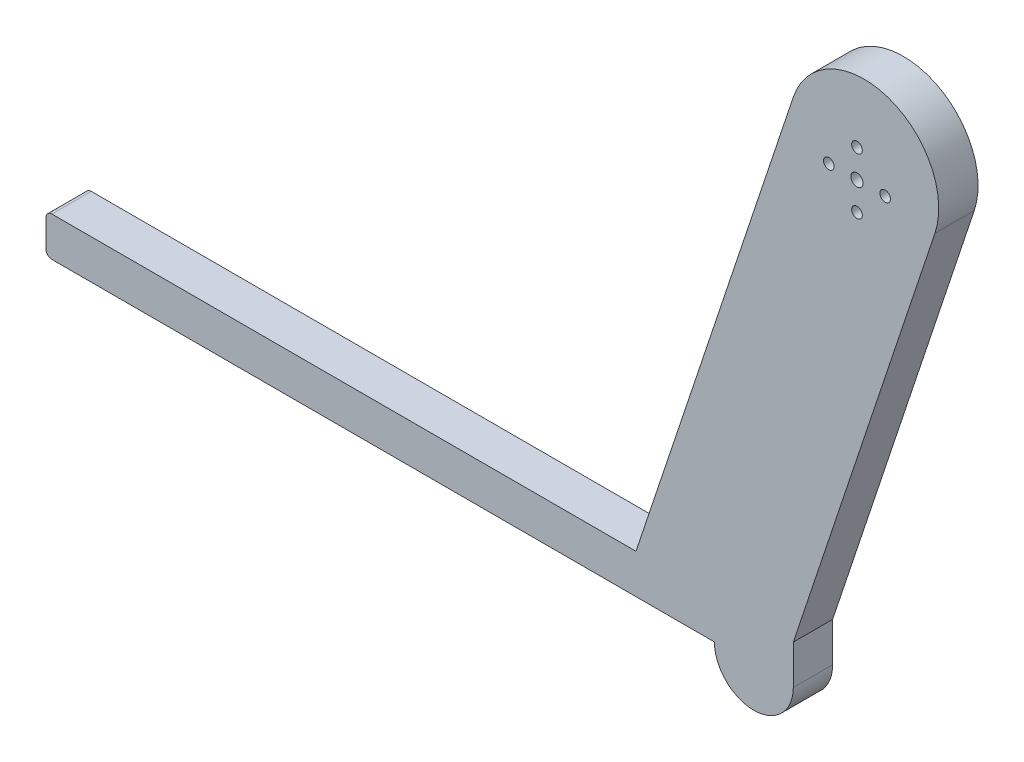
ISO-10303-21;
HEADER;
FILE_DESCRIPTION(('STEP AP214'),'2;1');
FILE_NAME('part.step','',(''),(''),'','','');
FILE_SCHEMA(('AUTOMOTIVE_DESIGN { 1 0 10303 214 1 1 1 1 }'));
ENDSEC;
DATA;
#1=APPLICATION_CONTEXT('core data for automotive mechanical design processes');
#2=APPLICATION_PROTOCOL_DEFINITION('international standard','automotive_design',2000,#1);
#3=PRODUCT_CONTEXT('',#1,'mechanical');
#4=PRODUCT('Part','Part','',(#3));
#5=PRODUCT_RELATED_PRODUCT_CATEGORY('part','',(#4));
#6=PRODUCT_DEFINITION_FORMATION('','',#4);
#7=PRODUCT_DEFINITION_CONTEXT('part definition',#1,'design');
#8=PRODUCT_DEFINITION('design','',#6,#7);
#9=PRODUCT_DEFINITION_SHAPE('','',#8);
#10=(LENGTH_UNIT() NAMED_UNIT(*) SI_UNIT(.MILLI.,.METRE.));
#11=(NAMED_UNIT(*) PLANE_ANGLE_UNIT() SI_UNIT($,.RADIAN.));
#12=(NAMED_UNIT(*) SI_UNIT($,.STERADIAN.) SOLID_ANGLE_UNIT());
#13=UNCERTAINTY_MEASURE_WITH_UNIT(LENGTH_MEASURE(1.E-05),#10,'distance_accuracy_value','');
#14=(GEOMETRIC_REPRESENTATION_CONTEXT(3) GLOBAL_UNCERTAINTY_ASSIGNED_CONTEXT((#13)) GLOBAL_UNIT_ASSIGNED_CONTEXT((#10,
#11,#12)) REPRESENTATION_CONTEXT('',''));
#15=CARTESIAN_POINT('',(0.,0.,0.));
#16=DIRECTION('',(0.,0.,1.));
#17=DIRECTION('',(1.,0.,0.));
#18=AXIS2_PLACEMENT_3D('',#15,#16,#17);
#19=CARTESIAN_POINT('',(29.9685982144808,-10.,10.));
#20=DIRECTION('',(0.,0.,1.));
#21=DIRECTION('',(1.,0.,0.));
#22=AXIS2_PLACEMENT_3D('',#19,#20,#21);
#23=PLANE('',#22);
#24=CARTESIAN_POINT('',(56.1908642313417,109.872544890887,9.99999999999992));
#25=DIRECTION('',(0.,0.,1.));
#26=DIRECTION('',(1.,0.,0.));
#27=AXIS2_PLACEMENT_3D('',#24,#25,#26);
#28=CIRCLE('',#27,1.54999999999999);
#29=CARTESIAN_POINT('',(57.7408642313417,109.872544890887,9.99999999999992));
#30=VERTEX_POINT('',#29);
#31=EDGE_CURVE('E228',#30,#30,#28,.T.);
#32=ORIENTED_EDGE('',*,*,#31,.F.);
#33=EDGE_LOOP('',(#32));
#34=FACE_BOUND('',#33,.T.);
#35=CARTESIAN_POINT('',(63.3498642313417,109.872544890887,10.));
#36=DIRECTION('',(0.,0.,1.));
#37=DIRECTION('',(1.,0.,0.));
#38=AXIS2_PLACEMENT_3D('',#35,#36,#37);
#39=CIRCLE('',#38,1.35000000000002);
#40=CARTESIAN_POINT('',(64.6998642313417,109.872544890887,10.));
#41=VERTEX_POINT('',#40);
#42=EDGE_CURVE('E179',#41,#41,#39,.T.);
#43=ORIENTED_EDGE('',*,*,#42,.F.);
#44=EDGE_LOOP('',(#43));
#45=FACE_BOUND('',#44,.T.);
#46=CARTESIAN_POINT('',(56.1908642313417,117.031544890887,10.));
#47=DIRECTION('',(0.,0.,1.));
#48=DIRECTION('',(1.,0.,0.));
#49=AXIS2_PLACEMENT_3D('',#46,#47,#48);
#50=CIRCLE('',#49,1.35000000000001);
#51=CARTESIAN_POINT('',(57.5408642313417,117.031544890887,10.));
#52=VERTEX_POINT('',#51);
#53=EDGE_CURVE('E224',#52,#52,#50,.T.);
#54=ORIENTED_EDGE('',*,*,#53,.F.);
#55=EDGE_LOOP('',(#54));
#56=FACE_BOUND('',#55,.T.);
#57=DIRECTION('',(1.,0.,0.));
#58=VECTOR('',#57,1.);
#59=CARTESIAN_POINT('',(-148.5,0.,10.));
#60=LINE('',#59,#58);
#61=CARTESIAN_POINT('',(-148.5,0.,10.));
#62=VERTEX_POINT('',#61);
#63=CARTESIAN_POINT('',(0.,0.,10.));
#64=VERTEX_POINT('',#63);
#65=EDGE_CURVE('E150',#62,#64,#60,.T.);
#66=ORIENTED_EDGE('',*,*,#65,.F.);
#67=CARTESIAN_POINT('',(-148.5,-1.50000000000002,10.));
#68=DIRECTION('',(0.,0.,1.));
#69=DIRECTION('',(1.,0.,0.));
#70=AXIS2_PLACEMENT_3D('',#67,#68,#69);
#71=CIRCLE('',#70,1.5);
#72=CARTESIAN_POINT('',(-150.,-1.50000000000002,10.));
#73=VERTEX_POINT('',#72);
#74=EDGE_CURVE('E112',#62,#73,#71,.T.);
#75=ORIENTED_EDGE('',*,*,#74,.T.);
#76=DIRECTION('',(0.,-1.,0.));
#77=VECTOR('',#76,1.);
#78=CARTESIAN_POINT('',(-150.,-1.50000000000002,10.));
#79=LINE('',#78,#77);
#80=CARTESIAN_POINT('',(-150.,-8.50000000000002,10.));
#81=VERTEX_POINT('',#80);
#82=EDGE_CURVE('E105',#73,#81,#79,.T.);
#83=ORIENTED_EDGE('',*,*,#82,.T.);
#84=CARTESIAN_POINT('',(-148.5,-8.50000000000002,10.));
#85=DIRECTION('',(0.,0.,1.));
#86=DIRECTION('',(1.,0.,0.));
#87=AXIS2_PLACEMENT_3D('',#84,#85,#86);
#88=CIRCLE('',#87,1.49999999999999);
#89=CARTESIAN_POINT('',(-148.5,-10.,10.));
#90=VERTEX_POINT('',#89);
#91=EDGE_CURVE('E110',#81,#90,#88,.T.);
#92=ORIENTED_EDGE('',*,*,#91,.T.);
#93=DIRECTION('',(1.,0.,0.));
#94=VECTOR('',#93,1.);
#95=CARTESIAN_POINT('',(-148.5,-10.,10.));
#96=LINE('',#95,#94);
#97=CARTESIAN_POINT('',(19.9371964289617,-10.,10.));
#98=VERTEX_POINT('',#97);
#99=EDGE_CURVE('E127',#90,#98,#96,.T.);
#100=ORIENTED_EDGE('',*,*,#99,.T.);
#101=CARTESIAN_POINT('',(29.9685982144808,-10.,10.));
#102=DIRECTION('',(0.,0.,1.));
#103=DIRECTION('',(1.,0.,0.));
#104=AXIS2_PLACEMENT_3D('',#101,#102,#103);
#105=CIRCLE('',#104,10.0314017855192);
#106=CARTESIAN_POINT('',(40.,-10.,10.));
#107=VERTEX_POINT('',#106);
#108=EDGE_CURVE('E129',#98,#107,#105,.T.);
#109=ORIENTED_EDGE('',*,*,#108,.T.);
#110=DIRECTION('',(0.,1.,0.));
#111=VECTOR('',#110,1.);
#112=CARTESIAN_POINT('',(40.,-8.50000000000001,10.));
#113=LINE('',#112,#111);
#114=CARTESIAN_POINT('',(40.,0.,10.));
#115=VERTEX_POINT('',#114);
#116=EDGE_CURVE('E92',#107,#115,#113,.T.);
#117=ORIENTED_EDGE('',*,*,#116,.T.);
#118=DIRECTION('',(0.316227766016838,0.948683298050514,0.));
#119=VECTOR('',#118,1.);
#120=CARTESIAN_POINT('',(40.,0.,10.));
#121=LINE('',#120,#119);
#122=CARTESIAN_POINT('',(76.,108.,10.));
#123=VERTEX_POINT('',#122);
#124=EDGE_CURVE('E169',#115,#123,#121,.T.);
#125=ORIENTED_EDGE('',*,*,#124,.T.);
#126=CARTESIAN_POINT('',(58.,114.,10.));
#127=DIRECTION('',(0.,0.,-1.));
#128=DIRECTION('',(-1.,0.,0.));
#129=AXIS2_PLACEMENT_3D('',#126,#127,#128);
#130=CIRCLE('',#129,18.9736659610103);
#131=CARTESIAN_POINT('',(40.,120.,10.));
#132=VERTEX_POINT('',#131);
#133=EDGE_CURVE('E219',#132,#123,#130,.T.);
#134=ORIENTED_EDGE('',*,*,#133,.F.);
#135=DIRECTION('',(0.316227766016838,0.948683298050514,0.));
#136=VECTOR('',#135,1.);
#137=CARTESIAN_POINT('',(0.,0.,10.));
#138=LINE('',#137,#136);
#139=EDGE_CURVE('E187',#64,#132,#138,.T.);
#140=ORIENTED_EDGE('',*,*,#139,.F.);
#141=EDGE_LOOP('',(#66,#75,#83,#92,#100,#109,#117,#125,#134,#140));
#142=FACE_BOUND('',#141,.T.);
#143=CARTESIAN_POINT('',(49.0318642313417,109.872544890887,10.));
#144=DIRECTION('',(0.,0.,-1.));
#145=DIRECTION('',(-1.,0.,0.));
#146=AXIS2_PLACEMENT_3D('',#143,#144,#145);
#147=CIRCLE('',#146,1.35000000000001);
#148=CARTESIAN_POINT('',(47.6818642313417,109.872544890887,10.));
#149=VERTEX_POINT('',#148);
#150=EDGE_CURVE('E227',#149,#149,#147,.T.);
#151=ORIENTED_EDGE('',*,*,#150,.T.);
#152=EDGE_LOOP('',(#151));
#153=FACE_BOUND('',#152,.T.);
#154=CARTESIAN_POINT('',(56.1908642313417,102.713544890887,10.));
#155=DIRECTION('',(0.,0.,-1.));
#156=DIRECTION('',(-1.,0.,0.));
#157=AXIS2_PLACEMENT_3D('',#154,#155,#156);
#158=CIRCLE('',#157,1.35000000000001);
#159=CARTESIAN_POINT('',(54.8408642313417,102.713544890887,10.));
#160=VERTEX_POINT('',#159);
#161=EDGE_CURVE('E184',#160,#160,#158,.T.);
#162=ORIENTED_EDGE('',*,*,#161,.T.);
#163=EDGE_LOOP('',(#162));
#164=FACE_BOUND('',#163,.T.);
#165=ADVANCED_FACE('F39',(#34,#45,#56,#142,#153,#164),#23,.T.);
#166=CARTESIAN_POINT('',(29.9685982144808,-10.,0.));
#167=DIRECTION('',(0.,0.,1.));
#168=DIRECTION('',(1.,0.,0.));
#169=AXIS2_PLACEMENT_3D('',#166,#167,#168);
#170=PLANE('',#169);
#171=CARTESIAN_POINT('',(56.1908642313417,109.872544890887,0.));
#172=DIRECTION('',(0.,0.,1.));
#173=DIRECTION('',(1.,0.,0.));
#174=AXIS2_PLACEMENT_3D('',#171,#172,#173);
#175=CIRCLE('',#174,9.80000000000001);
#176=CARTESIAN_POINT('',(65.9908642313417,109.872544890887,0.));
#177=VERTEX_POINT('',#176);
#178=EDGE_CURVE('E247',#177,#177,#175,.T.);
#179=ORIENTED_EDGE('',*,*,#178,.T.);
#180=EDGE_LOOP('',(#179));
#181=FACE_BOUND('',#180,.T.);
#182=DIRECTION('',(1.,0.,0.));
#183=VECTOR('',#182,1.);
#184=CARTESIAN_POINT('',(-148.5,0.,0.));
#185=LINE('',#184,#183);
#186=CARTESIAN_POINT('',(-148.5,0.,0.));
#187=VERTEX_POINT('',#186);
#188=CARTESIAN_POINT('',(0.,0.,0.));
#189=VERTEX_POINT('',#188);
#190=EDGE_CURVE('E135',#187,#189,#185,.T.);
#191=ORIENTED_EDGE('',*,*,#190,.T.);
#192=DIRECTION('',(0.316227766016838,0.948683298050514,0.));
#193=VECTOR('',#192,1.);
#194=CARTESIAN_POINT('',(0.,0.,0.));
#195=LINE('',#194,#193);
#196=CARTESIAN_POINT('',(40.,120.,0.));
#197=VERTEX_POINT('',#196);
#198=EDGE_CURVE('E181',#189,#197,#195,.T.);
#199=ORIENTED_EDGE('',*,*,#198,.T.);
#200=CARTESIAN_POINT('',(58.,114.,0.));
#201=DIRECTION('',(0.,0.,-1.));
#202=DIRECTION('',(-1.,0.,0.));
#203=AXIS2_PLACEMENT_3D('',#200,#201,#202);
#204=CIRCLE('',#203,18.9736659610103);
#205=CARTESIAN_POINT('',(76.,108.,0.));
#206=VERTEX_POINT('',#205);
#207=EDGE_CURVE('E178',#197,#206,#204,.T.);
#208=ORIENTED_EDGE('',*,*,#207,.T.);
#209=DIRECTION('',(0.316227766016838,0.948683298050514,0.));
#210=VECTOR('',#209,1.);
#211=CARTESIAN_POINT('',(40.,0.,0.));
#212=LINE('',#211,#210);
#213=CARTESIAN_POINT('',(40.,0.,0.));
#214=VERTEX_POINT('',#213);
#215=EDGE_CURVE('E166',#214,#206,#212,.T.);
#216=ORIENTED_EDGE('',*,*,#215,.F.);
#217=DIRECTION('',(0.,-1.,0.));
#218=VECTOR('',#217,1.);
#219=CARTESIAN_POINT('',(40.,-8.50000000000001,0.));
#220=LINE('',#219,#218);
#221=CARTESIAN_POINT('',(40.,-10.,0.));
#222=VERTEX_POINT('',#221);
#223=EDGE_CURVE('E138',#214,#222,#220,.T.);
#224=ORIENTED_EDGE('',*,*,#223,.T.);
#225=CARTESIAN_POINT('',(29.9685982144808,-10.,0.));
#226=DIRECTION('',(0.,0.,1.));
#227=DIRECTION('',(1.,0.,0.));
#228=AXIS2_PLACEMENT_3D('',#225,#226,#227);
#229=CIRCLE('',#228,10.0314017855192);
#230=CARTESIAN_POINT('',(19.9371964289617,-10.,0.));
#231=VERTEX_POINT('',#230);
#232=EDGE_CURVE('E142',#231,#222,#229,.T.);
#233=ORIENTED_EDGE('',*,*,#232,.F.);
#234=DIRECTION('',(1.,0.,0.));
#235=VECTOR('',#234,1.);
#236=CARTESIAN_POINT('',(-148.5,-10.,0.));
#237=LINE('',#236,#235);
#238=CARTESIAN_POINT('',(-148.5,-10.,0.));
#239=VERTEX_POINT('',#238);
#240=EDGE_CURVE('E145',#239,#231,#237,.T.);
#241=ORIENTED_EDGE('',*,*,#240,.F.);
#242=CARTESIAN_POINT('',(-148.5,-8.50000000000002,0.));
#243=DIRECTION('',(0.,0.,1.));
#244=DIRECTION('',(1.,0.,0.));
#245=AXIS2_PLACEMENT_3D('',#242,#243,#244);
#246=CIRCLE('',#245,1.49999999999999);
#247=CARTESIAN_POINT('',(-150.,-8.50000000000002,0.));
#248=VERTEX_POINT('',#247);
#249=EDGE_CURVE('E147',#248,#239,#246,.T.);
#250=ORIENTED_EDGE('',*,*,#249,.F.);
#251=DIRECTION('',(0.,-1.,0.));
#252=VECTOR('',#251,1.);
#253=CARTESIAN_POINT('',(-150.,-1.50000000000002,0.));
#254=LINE('',#253,#252);
#255=CARTESIAN_POINT('',(-150.,-1.50000000000002,0.));
#256=VERTEX_POINT('',#255);
#257=EDGE_CURVE('E119',#256,#248,#254,.T.);
#258=ORIENTED_EDGE('',*,*,#257,.F.);
#259=CARTESIAN_POINT('',(-148.5,-1.50000000000002,0.));
#260=DIRECTION('',(0.,0.,1.));
#261=DIRECTION('',(1.,0.,0.));
#262=AXIS2_PLACEMENT_3D('',#259,#260,#261);
#263=CIRCLE('',#262,1.5);
#264=EDGE_CURVE('E83',#187,#256,#263,.T.);
#265=ORIENTED_EDGE('',*,*,#264,.F.);
#266=EDGE_LOOP('',(#191,#199,#208,#216,#224,#233,#241,#250,#258,#265));
#267=FACE_BOUND('',#266,.T.);
#268=ADVANCED_FACE('F174',(#181,#267),#170,.F.);
#269=CARTESIAN_POINT('',(-148.5,0.,10.));
#270=DIRECTION('',(0.,1.,0.));
#271=DIRECTION('',(-1.,0.,0.));
#272=AXIS2_PLACEMENT_3D('',#269,#270,#271);
#273=PLANE('',#272);
#274=DIRECTION('',(0.,0.,-1.));
#275=VECTOR('',#274,1.);
#276=CARTESIAN_POINT('',(0.,0.,10.));
#277=LINE('',#276,#275);
#278=EDGE_CURVE('E191',#64,#189,#277,.T.);
#279=ORIENTED_EDGE('',*,*,#278,.T.);
#280=ORIENTED_EDGE('',*,*,#190,.F.);
#281=DIRECTION('',(0.,0.,-1.));
#282=VECTOR('',#281,1.);
#283=CARTESIAN_POINT('',(-148.5,0.,10.));
#284=LINE('',#283,#282);
#285=EDGE_CURVE('E11',#62,#187,#284,.T.);
#286=ORIENTED_EDGE('',*,*,#285,.F.);
#287=ORIENTED_EDGE('',*,*,#65,.T.);
#288=EDGE_LOOP('',(#279,#280,#286,#287));
#289=FACE_BOUND('',#288,.T.);
#290=ADVANCED_FACE('F41',(#289),#273,.T.);
#291=CARTESIAN_POINT('',(-148.5,-1.50000000000002,10.));
#292=DIRECTION('',(0.,0.,-1.));
#293=DIRECTION('',(-1.,0.,0.));
#294=AXIS2_PLACEMENT_3D('',#291,#292,#293);
#295=CYLINDRICAL_SURFACE('',#294,1.5);
#296=ORIENTED_EDGE('',*,*,#264,.T.);
#297=DIRECTION('',(0.,0.,-1.));
#298=VECTOR('',#297,1.);
#299=CARTESIAN_POINT('',(-150.,-1.50000000000002,10.));
#300=LINE('',#299,#298);
#301=EDGE_CURVE('E49',#73,#256,#300,.T.);
#302=ORIENTED_EDGE('',*,*,#301,.F.);
#303=ORIENTED_EDGE('',*,*,#74,.F.);
#304=ORIENTED_EDGE('',*,*,#285,.T.);
#305=EDGE_LOOP('',(#296,#302,#303,#304));
#306=FACE_BOUND('',#305,.T.);
#307=ADVANCED_FACE('F298',(#306),#295,.T.);
#308=CARTESIAN_POINT('',(-150.,-1.50000000000002,10.));
#309=DIRECTION('',(1.,0.,0.));
#310=DIRECTION('',(0.,1.,0.));
#311=AXIS2_PLACEMENT_3D('',#308,#309,#310);
#312=PLANE('',#311);
#313=ORIENTED_EDGE('',*,*,#257,.T.);
#314=DIRECTION('',(0.,0.,-1.));
#315=VECTOR('',#314,1.);
#316=CARTESIAN_POINT('',(-150.,-8.50000000000002,10.));
#317=LINE('',#316,#315);
#318=EDGE_CURVE('E116',#81,#248,#317,.T.);
#319=ORIENTED_EDGE('',*,*,#318,.F.);
#320=ORIENTED_EDGE('',*,*,#82,.F.);
#321=ORIENTED_EDGE('',*,*,#301,.T.);
#322=EDGE_LOOP('',(#313,#319,#320,#321));
#323=FACE_BOUND('',#322,.T.);
#324=ADVANCED_FACE('F117',(#323),#312,.F.);
#325=CARTESIAN_POINT('',(-148.5,-8.50000000000002,10.));
#326=DIRECTION('',(0.,0.,-1.));
#327=DIRECTION('',(-1.,0.,0.));
#328=AXIS2_PLACEMENT_3D('',#325,#326,#327);
#329=CYLINDRICAL_SURFACE('',#328,1.49999999999999);
#330=ORIENTED_EDGE('',*,*,#249,.T.);
#331=DIRECTION('',(0.,0.,-1.));
#332=VECTOR('',#331,1.);
#333=CARTESIAN_POINT('',(-148.5,-10.,10.));
#334=LINE('',#333,#332);
#335=EDGE_CURVE('E122',#90,#239,#334,.T.);
#336=ORIENTED_EDGE('',*,*,#335,.F.);
#337=ORIENTED_EDGE('',*,*,#91,.F.);
#338=ORIENTED_EDGE('',*,*,#318,.T.);
#339=EDGE_LOOP('',(#330,#336,#337,#338));
#340=FACE_BOUND('',#339,.T.);
#341=ADVANCED_FACE('F124',(#340),#329,.T.);
#342=CARTESIAN_POINT('',(-148.5,-10.,10.));
#343=DIRECTION('',(0.,1.,0.));
#344=DIRECTION('',(0.,0.,1.));
#345=AXIS2_PLACEMENT_3D('',#342,#343,#344);
#346=PLANE('',#345);
#347=ORIENTED_EDGE('',*,*,#240,.T.);
#348=DIRECTION('',(0.,0.,-1.));
#349=VECTOR('',#348,1.);
#350=CARTESIAN_POINT('',(19.9371964289617,-10.,10.));
#351=LINE('',#350,#349);
#352=EDGE_CURVE('E154',#98,#231,#351,.T.);
#353=ORIENTED_EDGE('',*,*,#352,.F.);
#354=ORIENTED_EDGE('',*,*,#99,.F.);
#355=ORIENTED_EDGE('',*,*,#335,.T.);
#356=EDGE_LOOP('',(#347,#353,#354,#355));
#357=FACE_BOUND('',#356,.T.);
#358=ADVANCED_FACE('F205',(#357),#346,.F.);
#359=CARTESIAN_POINT('',(29.9685982144808,-10.,10.));
#360=DIRECTION('',(0.,0.,-1.));
#361=DIRECTION('',(-1.,0.,0.));
#362=AXIS2_PLACEMENT_3D('',#359,#360,#361);
#363=CYLINDRICAL_SURFACE('',#362,10.0314017855192);
#364=ORIENTED_EDGE('',*,*,#232,.T.);
#365=DIRECTION('',(0.,0.,-1.));
#366=VECTOR('',#365,1.);
#367=CARTESIAN_POINT('',(40.,-10.,10.));
#368=LINE('',#367,#366);
#369=EDGE_CURVE('E157',#107,#222,#368,.T.);
#370=ORIENTED_EDGE('',*,*,#369,.F.);
#371=ORIENTED_EDGE('',*,*,#108,.F.);
#372=ORIENTED_EDGE('',*,*,#352,.T.);
#373=EDGE_LOOP('',(#364,#370,#371,#372));
#374=FACE_BOUND('',#373,.T.);
#375=ADVANCED_FACE('F203',(#374),#363,.T.);
#376=CARTESIAN_POINT('',(40.,-8.50000000000001,10.));
#377=DIRECTION('',(1.,0.,0.));
#378=DIRECTION('',(0.,0.,-1.));
#379=AXIS2_PLACEMENT_3D('',#376,#377,#378);
#380=PLANE('',#379);
#381=ORIENTED_EDGE('',*,*,#223,.F.);
#382=DIRECTION('',(0.,0.,-1.));
#383=VECTOR('',#382,1.);
#384=CARTESIAN_POINT('',(40.,0.,10.));
#385=LINE('',#384,#383);
#386=EDGE_CURVE('E134',#115,#214,#385,.T.);
#387=ORIENTED_EDGE('',*,*,#386,.F.);
#388=ORIENTED_EDGE('',*,*,#116,.F.);
#389=ORIENTED_EDGE('',*,*,#369,.T.);
#390=EDGE_LOOP('',(#381,#387,#388,#389));
#391=FACE_BOUND('',#390,.T.);
#392=ADVANCED_FACE('F170',(#391),#380,.T.);
#393=CARTESIAN_POINT('',(40.,0.,10.));
#394=DIRECTION('',(-0.948683298050514,0.316227766016838,0.));
#395=DIRECTION('',(-0.316227766016838,-0.948683298050514,0.));
#396=AXIS2_PLACEMENT_3D('',#393,#394,#395);
#397=PLANE('',#396);
#398=ORIENTED_EDGE('',*,*,#215,.T.);
#399=DIRECTION('',(0.,0.,-1.));
#400=VECTOR('',#399,1.);
#401=CARTESIAN_POINT('',(76.,108.,10.));
#402=LINE('',#401,#400);
#403=EDGE_CURVE('E139',#123,#206,#402,.T.);
#404=ORIENTED_EDGE('',*,*,#403,.F.);
#405=ORIENTED_EDGE('',*,*,#124,.F.);
#406=ORIENTED_EDGE('',*,*,#386,.T.);
#407=EDGE_LOOP('',(#398,#404,#405,#406));
#408=FACE_BOUND('',#407,.T.);
#409=ADVANCED_FACE('F163',(#408),#397,.F.);
#410=CARTESIAN_POINT('',(58.,114.,10.));
#411=DIRECTION('',(0.,0.,-1.));
#412=DIRECTION('',(-1.,0.,0.));
#413=AXIS2_PLACEMENT_3D('',#410,#411,#412);
#414=CYLINDRICAL_SURFACE('',#413,18.9736659610103);
#415=ORIENTED_EDGE('',*,*,#207,.F.);
#416=DIRECTION('',(0.,0.,-1.));
#417=VECTOR('',#416,1.);
#418=CARTESIAN_POINT('',(40.,120.,10.));
#419=LINE('',#418,#417);
#420=EDGE_CURVE('E194',#132,#197,#419,.T.);
#421=ORIENTED_EDGE('',*,*,#420,.F.);
#422=ORIENTED_EDGE('',*,*,#133,.T.);
#423=ORIENTED_EDGE('',*,*,#403,.T.);
#424=EDGE_LOOP('',(#415,#421,#422,#423));
#425=FACE_BOUND('',#424,.T.);
#426=ADVANCED_FACE('F287',(#425),#414,.T.);
#427=CARTESIAN_POINT('',(0.,0.,10.));
#428=DIRECTION('',(-0.948683298050514,0.316227766016838,0.));
#429=DIRECTION('',(-0.316227766016838,-0.948683298050514,0.));
#430=AXIS2_PLACEMENT_3D('',#427,#428,#429);
#431=PLANE('',#430);
#432=ORIENTED_EDGE('',*,*,#198,.F.);
#433=ORIENTED_EDGE('',*,*,#278,.F.);
#434=ORIENTED_EDGE('',*,*,#139,.T.);
#435=ORIENTED_EDGE('',*,*,#420,.T.);
#436=EDGE_LOOP('',(#432,#433,#434,#435));
#437=FACE_BOUND('',#436,.T.);
#438=ADVANCED_FACE('F214',(#437),#431,.T.);
#439=CARTESIAN_POINT('',(56.1908642313417,117.031544890887,10.));
#440=DIRECTION('',(0.,0.,-1.));
#441=DIRECTION('',(-1.,0.,0.));
#442=AXIS2_PLACEMENT_3D('',#439,#440,#441);
#443=CYLINDRICAL_SURFACE('',#442,1.35000000000001);
#444=CARTESIAN_POINT('',(56.1908642313417,117.031544890887,2.));
#445=DIRECTION('',(0.,0.,1.));
#446=DIRECTION('',(1.,0.,0.));
#447=AXIS2_PLACEMENT_3D('',#444,#445,#446);
#448=CIRCLE('',#447,1.35000000000001);
#449=CARTESIAN_POINT('',(57.5408642313417,117.031544890887,2.));
#450=VERTEX_POINT('',#449);
#451=EDGE_CURVE('E235',#450,#450,#448,.T.);
#452=ORIENTED_EDGE('',*,*,#451,.F.);
#453=EDGE_LOOP('',(#452));
#454=FACE_BOUND('',#453,.T.);
#455=ORIENTED_EDGE('',*,*,#53,.T.);
#456=EDGE_LOOP('',(#455));
#457=FACE_BOUND('',#456,.T.);
#458=ADVANCED_FACE('F274',(#454,#457),#443,.F.);
#459=CARTESIAN_POINT('',(49.0318642313417,109.872544890887,10.));
#460=DIRECTION('',(0.,0.,-1.));
#461=DIRECTION('',(-1.,0.,0.));
#462=AXIS2_PLACEMENT_3D('',#459,#460,#461);
#463=CYLINDRICAL_SURFACE('',#462,1.35000000000001);
#464=CARTESIAN_POINT('',(49.0318642313417,109.872544890887,2.));
#465=DIRECTION('',(0.,0.,1.));
#466=DIRECTION('',(1.,0.,0.));
#467=AXIS2_PLACEMENT_3D('',#464,#465,#466);
#468=CIRCLE('',#467,1.35000000000001);
#469=CARTESIAN_POINT('',(50.3818642313417,109.872544890887,2.));
#470=VERTEX_POINT('',#469);
#471=EDGE_CURVE('E238',#470,#470,#468,.F.);
#472=ORIENTED_EDGE('',*,*,#471,.T.);
#473=EDGE_LOOP('',(#472));
#474=FACE_BOUND('',#473,.T.);
#475=ORIENTED_EDGE('',*,*,#150,.F.);
#476=EDGE_LOOP('',(#475));
#477=FACE_BOUND('',#476,.T.);
#478=ADVANCED_FACE('F276',(#474,#477),#463,.F.);
#479=CARTESIAN_POINT('',(56.1908642313417,102.713544890887,10.));
#480=DIRECTION('',(0.,0.,-1.));
#481=DIRECTION('',(-1.,0.,0.));
#482=AXIS2_PLACEMENT_3D('',#479,#480,#481);
#483=CYLINDRICAL_SURFACE('',#482,1.35000000000001);
#484=CARTESIAN_POINT('',(56.1908642313417,102.713544890887,2.));
#485=DIRECTION('',(0.,0.,1.));
#486=DIRECTION('',(1.,0.,0.));
#487=AXIS2_PLACEMENT_3D('',#484,#485,#486);
#488=CIRCLE('',#487,1.35000000000001);
#489=CARTESIAN_POINT('',(57.5408642313417,102.713544890887,2.));
#490=VERTEX_POINT('',#489);
#491=EDGE_CURVE('E241',#490,#490,#488,.F.);
#492=ORIENTED_EDGE('',*,*,#491,.T.);
#493=EDGE_LOOP('',(#492));
#494=FACE_BOUND('',#493,.T.);
#495=ORIENTED_EDGE('',*,*,#161,.F.);
#496=EDGE_LOOP('',(#495));
#497=FACE_BOUND('',#496,.T.);
#498=ADVANCED_FACE('F283',(#494,#497),#483,.F.);
#499=CARTESIAN_POINT('',(63.3498642313417,109.872544890887,10.));
#500=DIRECTION('',(0.,0.,-1.));
#501=DIRECTION('',(-1.,0.,0.));
#502=AXIS2_PLACEMENT_3D('',#499,#500,#501);
#503=CYLINDRICAL_SURFACE('',#502,1.35000000000002);
#504=CARTESIAN_POINT('',(63.3498642313417,109.872544890887,2.));
#505=DIRECTION('',(0.,0.,1.));
#506=DIRECTION('',(1.,0.,0.));
#507=AXIS2_PLACEMENT_3D('',#504,#505,#506);
#508=CIRCLE('',#507,1.35000000000002);
#509=CARTESIAN_POINT('',(64.6998642313417,109.872544890887,2.));
#510=VERTEX_POINT('',#509);
#511=EDGE_CURVE('E244',#510,#510,#508,.T.);
#512=ORIENTED_EDGE('',*,*,#511,.F.);
#513=EDGE_LOOP('',(#512));
#514=FACE_BOUND('',#513,.T.);
#515=ORIENTED_EDGE('',*,*,#42,.T.);
#516=EDGE_LOOP('',(#515));
#517=FACE_BOUND('',#516,.T.);
#518=ADVANCED_FACE('F263',(#514,#517),#503,.F.);
#519=CARTESIAN_POINT('',(56.1908642313417,109.872544890887,9.99999999999992));
#520=DIRECTION('',(0.,0.,-1.));
#521=DIRECTION('',(-1.,0.,0.));
#522=AXIS2_PLACEMENT_3D('',#519,#520,#521);
#523=CYLINDRICAL_SURFACE('',#522,1.54999999999999);
#524=CARTESIAN_POINT('',(56.1908642313417,109.872544890887,2.));
#525=DIRECTION('',(0.,0.,1.));
#526=DIRECTION('',(1.,0.,0.));
#527=AXIS2_PLACEMENT_3D('',#524,#525,#526);
#528=CIRCLE('',#527,1.54999999999999);
#529=CARTESIAN_POINT('',(57.7408642313417,109.872544890887,2.));
#530=VERTEX_POINT('',#529);
#531=EDGE_CURVE('E43',#530,#530,#528,.T.);
#532=ORIENTED_EDGE('',*,*,#531,.F.);
#533=EDGE_LOOP('',(#532));
#534=FACE_BOUND('',#533,.T.);
#535=ORIENTED_EDGE('',*,*,#31,.T.);
#536=EDGE_LOOP('',(#535));
#537=FACE_BOUND('',#536,.T.);
#538=ADVANCED_FACE('F260',(#534,#537),#523,.F.);
#539=CARTESIAN_POINT('',(56.1908642313417,109.872544890887,2.));
#540=DIRECTION('',(0.,0.,1.));
#541=DIRECTION('',(1.,0.,0.));
#542=AXIS2_PLACEMENT_3D('',#539,#540,#541);
#543=PLANE('',#542);
#544=ORIENTED_EDGE('',*,*,#451,.T.);
#545=EDGE_LOOP('',(#544));
#546=FACE_BOUND('',#545,.T.);
#547=ORIENTED_EDGE('',*,*,#491,.F.);
#548=EDGE_LOOP('',(#547));
#549=FACE_BOUND('',#548,.T.);
#550=ORIENTED_EDGE('',*,*,#511,.T.);
#551=EDGE_LOOP('',(#550));
#552=FACE_BOUND('',#551,.T.);
#553=ORIENTED_EDGE('',*,*,#531,.T.);
#554=EDGE_LOOP('',(#553));
#555=FACE_BOUND('',#554,.T.);
#556=CARTESIAN_POINT('',(56.1908642313417,109.872544890887,2.));
#557=DIRECTION('',(0.,0.,1.));
#558=DIRECTION('',(1.,0.,0.));
#559=AXIS2_PLACEMENT_3D('',#556,#557,#558);
#560=CIRCLE('',#559,9.80000000000001);
#561=CARTESIAN_POINT('',(65.9908642313417,109.872544890887,2.));
#562=VERTEX_POINT('',#561);
#563=EDGE_CURVE('E250',#562,#562,#560,.T.);
#564=ORIENTED_EDGE('',*,*,#563,.F.);
#565=EDGE_LOOP('',(#564));
#566=FACE_BOUND('',#565,.T.);
#567=ORIENTED_EDGE('',*,*,#471,.F.);
#568=EDGE_LOOP('',(#567));
#569=FACE_BOUND('',#568,.T.);
#570=ADVANCED_FACE('F257',(#546,#549,#552,#555,#566,#569),#543,.F.);
#571=CARTESIAN_POINT('',(56.1908642313417,109.872544890887,2.));
#572=DIRECTION('',(0.,0.,-1.));
#573=DIRECTION('',(-1.,0.,0.));
#574=AXIS2_PLACEMENT_3D('',#571,#572,#573);
#575=CYLINDRICAL_SURFACE('',#574,9.80000000000001);
#576=ORIENTED_EDGE('',*,*,#563,.T.);
#577=EDGE_LOOP('',(#576));
#578=FACE_BOUND('',#577,.T.);
#579=ORIENTED_EDGE('',*,*,#178,.F.);
#580=EDGE_LOOP('',(#579));
#581=FACE_BOUND('',#580,.T.);
#582=ADVANCED_FACE('F361',(#578,#581),#575,.F.);
#583=CLOSED_SHELL('',(#165,#268,#290,#307,#324,#341,#358,#375,#392,#409,#426,#438,#458,#478,
#498,#518,#538,#570,#582));
#584=MANIFOLD_SOLID_BREP('B2',#583);
#585=ADVANCED_BREP_SHAPE_REPRESENTATION('',(#18,#584),#14);
#586=SHAPE_DEFINITION_REPRESENTATION(#9,#585);
ENDSEC;
END-ISO-10303-21;
